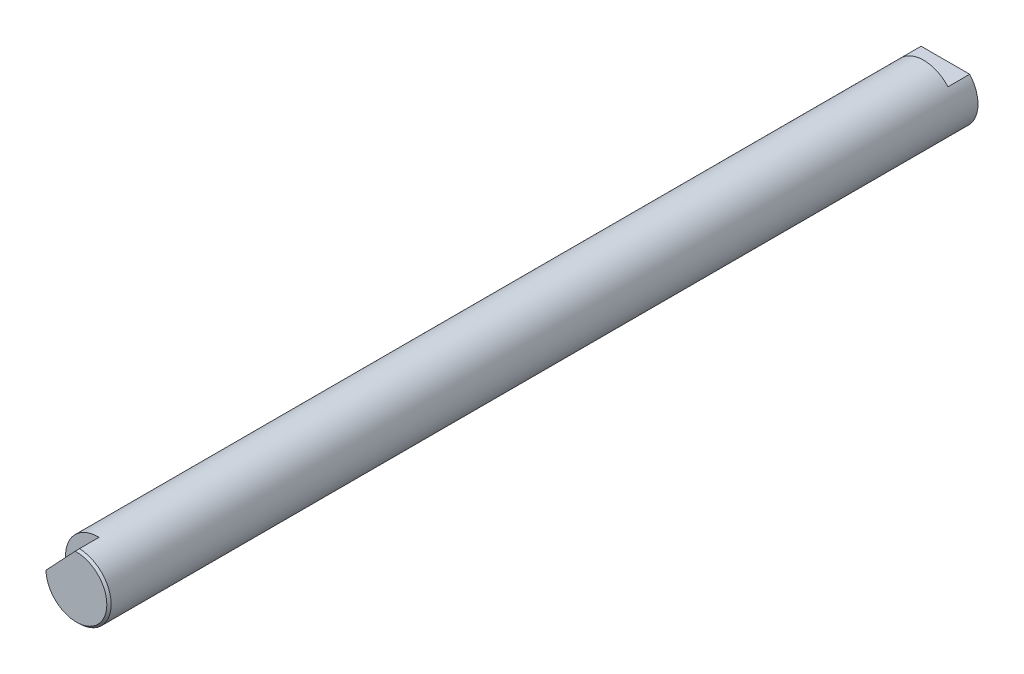
ISO-10303-21;
HEADER;
FILE_DESCRIPTION(('STEP AP214'),'2;1');
FILE_NAME('part.step','',(''),(''),'','','');
FILE_SCHEMA(('AUTOMOTIVE_DESIGN { 1 0 10303 214 1 1 1 1 }'));
ENDSEC;
DATA;
#1=APPLICATION_CONTEXT('core data for automotive mechanical design processes');
#2=APPLICATION_PROTOCOL_DEFINITION('international standard','automotive_design',2000,#1);
#3=PRODUCT_CONTEXT('',#1,'mechanical');
#4=PRODUCT('Part','Part','',(#3));
#5=PRODUCT_RELATED_PRODUCT_CATEGORY('part','',(#4));
#6=PRODUCT_DEFINITION_FORMATION('','',#4);
#7=PRODUCT_DEFINITION_CONTEXT('part definition',#1,'design');
#8=PRODUCT_DEFINITION('design','',#6,#7);
#9=PRODUCT_DEFINITION_SHAPE('','',#8);
#10=(LENGTH_UNIT() NAMED_UNIT(*) SI_UNIT(.MILLI.,.METRE.));
#11=(NAMED_UNIT(*) PLANE_ANGLE_UNIT() SI_UNIT($,.RADIAN.));
#12=(NAMED_UNIT(*) SI_UNIT($,.STERADIAN.) SOLID_ANGLE_UNIT());
#13=UNCERTAINTY_MEASURE_WITH_UNIT(LENGTH_MEASURE(1.E-05),#10,'distance_accuracy_value','');
#14=(GEOMETRIC_REPRESENTATION_CONTEXT(3) GLOBAL_UNCERTAINTY_ASSIGNED_CONTEXT((#13)) GLOBAL_UNIT_ASSIGNED_CONTEXT((#10,
#11,#12)) REPRESENTATION_CONTEXT('',''));
#15=CARTESIAN_POINT('',(0.,0.,0.));
#16=DIRECTION('',(0.,0.,1.));
#17=DIRECTION('',(1.,0.,0.));
#18=AXIS2_PLACEMENT_3D('',#15,#16,#17);
#19=CARTESIAN_POINT('',(0.,0.,400.));
#20=DIRECTION('',(0.,0.,-1.));
#21=DIRECTION('',(-1.,0.,0.));
#22=AXIS2_PLACEMENT_3D('',#19,#20,#21);
#23=CYLINDRICAL_SURFACE('',#22,15.);
#24=CARTESIAN_POINT('',(0.,0.,399.));
#25=DIRECTION('',(0.,0.,1.));
#26=DIRECTION('',(1.,0.,0.));
#27=AXIS2_PLACEMENT_3D('',#24,#25,#26);
#28=CIRCLE('',#27,15.);
#29=CARTESIAN_POINT('',(0.381845302375439,14.9951390178635,399.));
#30=VERTEX_POINT('',#29);
#31=CARTESIAN_POINT('',(-14.9447162229317,-1.28664564509556,399.));
#32=VERTEX_POINT('',#31);
#33=EDGE_CURVE('E94',#30,#32,#28,.F.);
#34=ORIENTED_EDGE('',*,*,#33,.T.);
#35=DIRECTION('',(0.,0.,-1.));
#36=VECTOR('',#35,1.);
#37=CARTESIAN_POINT('',(-14.9447162229317,-1.28664564509556,400.));
#38=LINE('',#37,#36);
#39=CARTESIAN_POINT('',(-14.9447162229317,-1.28664564509556,390.));
#40=VERTEX_POINT('',#39);
#41=EDGE_CURVE('E54',#32,#40,#38,.T.);
#42=ORIENTED_EDGE('',*,*,#41,.T.);
#43=CARTESIAN_POINT('',(0.,0.,390.));
#44=DIRECTION('',(0.,0.,1.));
#45=DIRECTION('',(1.,0.,0.));
#46=AXIS2_PLACEMENT_3D('',#43,#44,#45);
#47=CIRCLE('',#46,15.);
#48=CARTESIAN_POINT('',(0.381845302375443,14.9951390178635,390.));
#49=VERTEX_POINT('',#48);
#50=EDGE_CURVE('E83',#49,#40,#47,.T.);
#51=ORIENTED_EDGE('',*,*,#50,.F.);
#52=DIRECTION('',(0.,0.,-1.));
#53=VECTOR('',#52,1.);
#54=CARTESIAN_POINT('',(0.381845302375444,14.9951390178635,400.));
#55=LINE('',#54,#53);
#56=EDGE_CURVE('E91',#49,#30,#55,.F.);
#57=ORIENTED_EDGE('',*,*,#56,.T.);
#58=EDGE_LOOP('',(#34,#42,#51,#57));
#59=FACE_BOUND('',#58,.T.);
#60=CARTESIAN_POINT('',(0.,0.,10.));
#61=DIRECTION('',(0.,0.,-1.));
#62=DIRECTION('',(-1.,0.,0.));
#63=AXIS2_PLACEMENT_3D('',#60,#61,#62);
#64=CIRCLE('',#63,15.);
#65=CARTESIAN_POINT('',(-11.1803398874989,10.,10.));
#66=VERTEX_POINT('',#65);
#67=CARTESIAN_POINT('',(11.1803398874989,10.,10.));
#68=VERTEX_POINT('',#67);
#69=EDGE_CURVE('E11',#66,#68,#64,.T.);
#70=ORIENTED_EDGE('',*,*,#69,.F.);
#71=DIRECTION('',(0.,0.,-1.));
#72=VECTOR('',#71,1.);
#73=CARTESIAN_POINT('',(-11.1803398874989,10.,400.));
#74=LINE('',#73,#72);
#75=CARTESIAN_POINT('',(-11.180339887499,10.,0.));
#76=VERTEX_POINT('',#75);
#77=EDGE_CURVE('E78',#66,#76,#74,.T.);
#78=ORIENTED_EDGE('',*,*,#77,.T.);
#79=CARTESIAN_POINT('',(0.,0.,0.));
#80=DIRECTION('',(0.,0.,1.));
#81=DIRECTION('',(1.,0.,0.));
#82=AXIS2_PLACEMENT_3D('',#79,#80,#81);
#83=CIRCLE('',#82,15.);
#84=CARTESIAN_POINT('',(11.1803398874989,10.,0.));
#85=VERTEX_POINT('',#84);
#86=EDGE_CURVE('E86',#76,#85,#83,.T.);
#87=ORIENTED_EDGE('',*,*,#86,.T.);
#88=DIRECTION('',(0.,0.,-1.));
#89=VECTOR('',#88,1.);
#90=CARTESIAN_POINT('',(11.1803398874989,10.,400.));
#91=LINE('',#90,#89);
#92=EDGE_CURVE('E46',#85,#68,#91,.F.);
#93=ORIENTED_EDGE('',*,*,#92,.T.);
#94=EDGE_LOOP('',(#70,#78,#87,#93));
#95=FACE_BOUND('',#94,.T.);
#96=ADVANCED_FACE('F32',(#59,#95),#23,.T.);
#97=CARTESIAN_POINT('',(0.,0.,400.));
#98=DIRECTION('',(0.,0.,1.));
#99=DIRECTION('',(1.,0.,0.));
#100=AXIS2_PLACEMENT_3D('',#97,#98,#99);
#101=PLANE('',#100);
#102=DIRECTION('',(0.685424668638395,0.728143546027805,0.));
#103=VECTOR('',#102,1.);
#104=CARTESIAN_POINT('',(17.0873305300018,32.7417883701883,400.));
#105=LINE('',#104,#103);
#106=CARTESIAN_POINT('',(-13.9971982413993,-0.280073902691454,400.));
#107=VERTEX_POINT('',#106);
#108=CARTESIAN_POINT('',(-0.565672679156949,13.9885672754594,400.));
#109=VERTEX_POINT('',#108);
#110=EDGE_CURVE('E87',#107,#109,#105,.T.);
#111=ORIENTED_EDGE('',*,*,#110,.F.);
#112=CARTESIAN_POINT('',(0.,0.,400.));
#113=DIRECTION('',(0.,0.,1.));
#114=DIRECTION('',(1.,0.,0.));
#115=AXIS2_PLACEMENT_3D('',#112,#113,#114);
#116=CIRCLE('',#115,14.);
#117=EDGE_CURVE('E90',#107,#109,#116,.T.);
#118=ORIENTED_EDGE('',*,*,#117,.T.);
#119=EDGE_LOOP('',(#111,#118));
#120=FACE_BOUND('',#119,.T.);
#121=ADVANCED_FACE('F134',(#120),#101,.T.);
#122=CARTESIAN_POINT('',(0.,0.,0.));
#123=DIRECTION('',(0.,0.,1.));
#124=DIRECTION('',(1.,0.,0.));
#125=AXIS2_PLACEMENT_3D('',#122,#123,#124);
#126=PLANE('',#125);
#127=ORIENTED_EDGE('',*,*,#86,.F.);
#128=DIRECTION('',(1.,0.,0.));
#129=VECTOR('',#128,1.);
#130=CARTESIAN_POINT('',(0.,10.,0.));
#131=LINE('',#130,#129);
#132=EDGE_CURVE('E39',#76,#85,#131,.T.);
#133=ORIENTED_EDGE('',*,*,#132,.T.);
#134=EDGE_LOOP('',(#127,#133));
#135=FACE_BOUND('',#134,.T.);
#136=ADVANCED_FACE('F89',(#135),#126,.F.);
#137=CARTESIAN_POINT('',(0.,0.,400.));
#138=DIRECTION('',(0.,0.,-1.));
#139=DIRECTION('',(-1.,0.,0.));
#140=AXIS2_PLACEMENT_3D('',#137,#138,#139);
#141=CONICAL_SURFACE('',#140,14.,0.785398163397457);
#142=CARTESIAN_POINT('',(-0.565868557028861,13.9883591895606,400.0002));
#143=CARTESIAN_POINT('',(-0.485988411892308,14.0732178396768,399.918638036296));
#144=CARTESIAN_POINT('',(-0.406346805669337,14.1578230840164,399.836579955246));
#145=CARTESIAN_POINT('',(-0.247519343054151,14.3265494183996,399.671543697454));
#146=CARTESIAN_POINT('',(-0.16833346151204,14.4106705351606,399.58856557224));
#147=CARTESIAN_POINT('',(-0.0103876760817338,14.5784602421051,399.421752738124));
#148=CARTESIAN_POINT('',(0.0683722302468649,14.6621288348811,399.337918034136));
#149=CARTESIAN_POINT('',(0.225494304730505,14.8290434933527,399.169445548825));
#150=CARTESIAN_POINT('',(0.303856450478535,14.9122895352448,399.084807723013));
#151=CARTESIAN_POINT('',(0.382029220132868,14.9953343982375,398.9998));
#152=B_SPLINE_CURVE_WITH_KNOTS('',3,(#142,#143,#144,#145,#146,#147,#148,#149,#150,#151),
.UNSPECIFIED.,.F.,.F.,(4,2,2,2,4),(0.,0.426738474104407,0.853453167684786,1.28016541403059,
1.70690143732116),.UNSPECIFIED.);
#153=EDGE_CURVE('E109',#109,#30,#152,.T.);
#154=ORIENTED_EDGE('',*,*,#153,.F.);
#155=ORIENTED_EDGE('',*,*,#117,.F.);
#156=CARTESIAN_POINT('',(-14.9449001406891,-1.28684102546951,398.9998));
#157=CARTESIAN_POINT('',(-14.8667273710348,-1.20379616247678,399.084807723013));
#158=CARTESIAN_POINT('',(-14.7883652252867,-1.12055012058474,399.169445548825));
#159=CARTESIAN_POINT('',(-14.6312431508031,-0.953635462113174,399.337918034136));
#160=CARTESIAN_POINT('',(-14.5524832444745,-0.86996686933717,399.421752738124));
#161=CARTESIAN_POINT('',(-14.3945374590442,-0.702177162392656,399.58856557224));
#162=CARTESIAN_POINT('',(-14.3153515775021,-0.618056045631644,399.671543697454));
#163=CARTESIAN_POINT('',(-14.1565241148869,-0.449329711248388,399.836579955246));
#164=CARTESIAN_POINT('',(-14.0768825086639,-0.364724466908786,399.918638036296));
#165=CARTESIAN_POINT('',(-13.9970023635274,-0.279865816792672,400.0002));
#166=B_SPLINE_CURVE_WITH_KNOTS('',3,(#156,#157,#158,#159,#160,#161,#162,#163,#164,#165),
.UNSPECIFIED.,.F.,.F.,(4,2,2,2,4),(0.,0.426736023290524,0.853448269636399,1.28016296321677,
1.70690143732119),.UNSPECIFIED.);
#167=EDGE_CURVE('E102',#32,#107,#166,.T.);
#168=ORIENTED_EDGE('',*,*,#167,.F.);
#169=ORIENTED_EDGE('',*,*,#33,.F.);
#170=EDGE_LOOP('',(#154,#155,#168,#169));
#171=FACE_BOUND('',#170,.T.);
#172=ADVANCED_FACE('F114',(#171),#141,.T.);
#173=CARTESIAN_POINT('',(5.78204181440248,43.3838160500644,390.));
#174=DIRECTION('',(0.,0.,1.));
#175=DIRECTION('',(1.,0.,0.));
#176=AXIS2_PLACEMENT_3D('',#173,#174,#175);
#177=PLANE('',#176);
#178=ORIENTED_EDGE('',*,*,#50,.T.);
#179=DIRECTION('',(0.685424668638395,0.728143546027805,0.));
#180=VECTOR('',#179,1.);
#181=CARTESIAN_POINT('',(17.0873305300018,32.7417883701883,390.));
#182=LINE('',#181,#180);
#183=EDGE_CURVE('E146',#40,#49,#182,.T.);
#184=ORIENTED_EDGE('',*,*,#183,.T.);
#185=EDGE_LOOP('',(#178,#184));
#186=FACE_BOUND('',#185,.T.);
#187=ADVANCED_FACE('F122',(#186),#177,.T.);
#188=CARTESIAN_POINT('',(17.0873305300018,32.7417883701883,390.));
#189=DIRECTION('',(0.728143546027805,-0.685424668638395,0.));
#190=DIRECTION('',(0.685424668638395,0.728143546027806,0.));
#191=AXIS2_PLACEMENT_3D('',#188,#189,#190);
#192=PLANE('',#191);
#193=ORIENTED_EDGE('',*,*,#183,.F.);
#194=ORIENTED_EDGE('',*,*,#41,.F.);
#195=ORIENTED_EDGE('',*,*,#167,.T.);
#196=ORIENTED_EDGE('',*,*,#110,.T.);
#197=ORIENTED_EDGE('',*,*,#153,.T.);
#198=ORIENTED_EDGE('',*,*,#56,.F.);
#199=EDGE_LOOP('',(#193,#194,#195,#196,#197,#198));
#200=FACE_BOUND('',#199,.T.);
#201=ADVANCED_FACE('F117',(#200),#192,.F.);
#202=CARTESIAN_POINT('',(20.,10.,10.));
#203=DIRECTION('',(0.,0.,-1.));
#204=DIRECTION('',(-1.,0.,0.));
#205=AXIS2_PLACEMENT_3D('',#202,#203,#204);
#206=PLANE('',#205);
#207=ORIENTED_EDGE('',*,*,#69,.T.);
#208=DIRECTION('',(-1.,0.,0.));
#209=VECTOR('',#208,1.);
#210=CARTESIAN_POINT('',(20.,10.,10.));
#211=LINE('',#210,#209);
#212=EDGE_CURVE('E152',#68,#66,#211,.T.);
#213=ORIENTED_EDGE('',*,*,#212,.T.);
#214=EDGE_LOOP('',(#207,#213));
#215=FACE_BOUND('',#214,.T.);
#216=ADVANCED_FACE('F121',(#215),#206,.T.);
#217=CARTESIAN_POINT('',(20.,10.,10.));
#218=DIRECTION('',(0.,-1.,0.));
#219=DIRECTION('',(0.,0.,-1.));
#220=AXIS2_PLACEMENT_3D('',#217,#218,#219);
#221=PLANE('',#220);
#222=ORIENTED_EDGE('',*,*,#212,.F.);
#223=ORIENTED_EDGE('',*,*,#92,.F.);
#224=ORIENTED_EDGE('',*,*,#132,.F.);
#225=ORIENTED_EDGE('',*,*,#77,.F.);
#226=EDGE_LOOP('',(#222,#223,#224,#225));
#227=FACE_BOUND('',#226,.T.);
#228=ADVANCED_FACE('F77',(#227),#221,.F.);
#229=CLOSED_SHELL('',(#96,#121,#136,#172,#187,#201,#216,#228));
#230=MANIFOLD_SOLID_BREP('B2',#229);
#231=ADVANCED_BREP_SHAPE_REPRESENTATION('',(#18,#230),#14);
#232=SHAPE_DEFINITION_REPRESENTATION(#9,#231);
ENDSEC;
END-ISO-10303-21;
